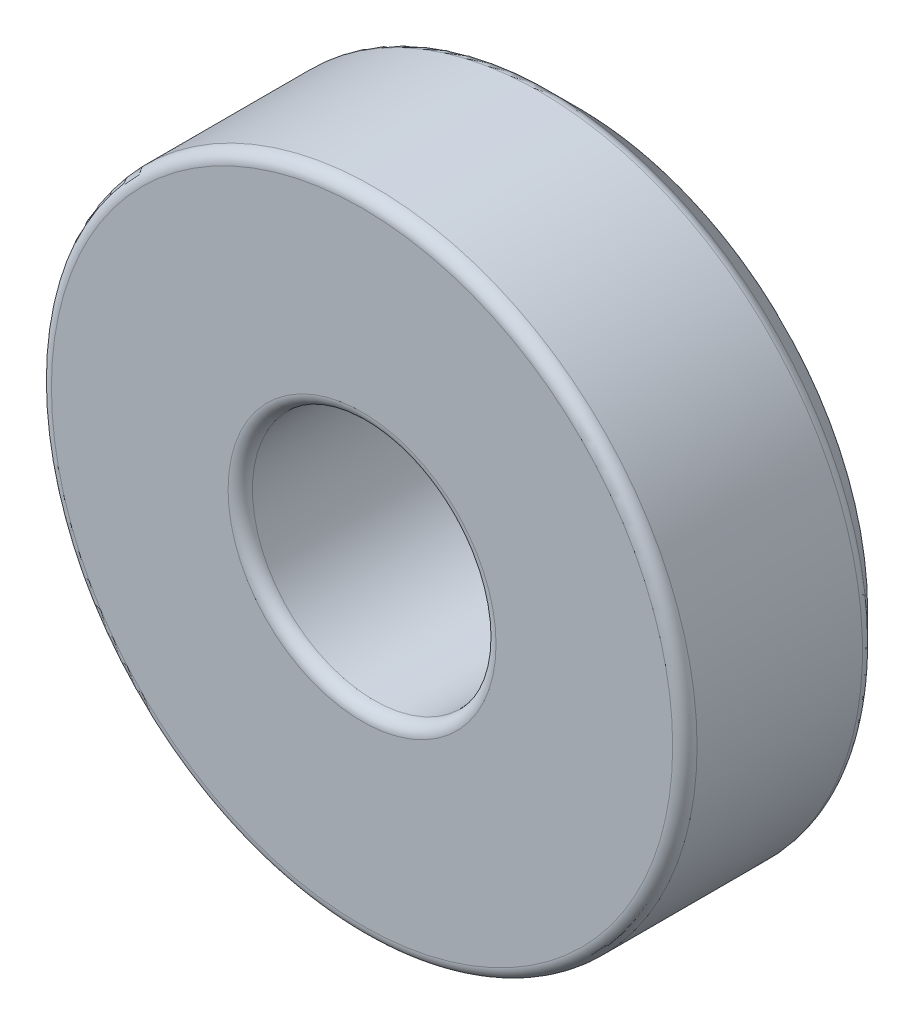
ISO-10303-21;
HEADER;
FILE_DESCRIPTION(('STEP AP214'),'2;1');
FILE_NAME('part.step','',(''),(''),'','','');
FILE_SCHEMA(('AUTOMOTIVE_DESIGN { 1 0 10303 214 1 1 1 1 }'));
ENDSEC;
DATA;
#1=APPLICATION_CONTEXT('core data for automotive mechanical design processes');
#2=APPLICATION_PROTOCOL_DEFINITION('international standard','automotive_design',2000,#1);
#3=PRODUCT_CONTEXT('',#1,'mechanical');
#4=PRODUCT('Part','Part','',(#3));
#5=PRODUCT_RELATED_PRODUCT_CATEGORY('part','',(#4));
#6=PRODUCT_DEFINITION_FORMATION('','',#4);
#7=PRODUCT_DEFINITION_CONTEXT('part definition',#1,'design');
#8=PRODUCT_DEFINITION('design','',#6,#7);
#9=PRODUCT_DEFINITION_SHAPE('','',#8);
#10=(LENGTH_UNIT() NAMED_UNIT(*) SI_UNIT(.MILLI.,.METRE.));
#11=(NAMED_UNIT(*) PLANE_ANGLE_UNIT() SI_UNIT($,.RADIAN.));
#12=(NAMED_UNIT(*) SI_UNIT($,.STERADIAN.) SOLID_ANGLE_UNIT());
#13=UNCERTAINTY_MEASURE_WITH_UNIT(LENGTH_MEASURE(1.E-05),#10,'distance_accuracy_value','');
#14=(GEOMETRIC_REPRESENTATION_CONTEXT(3) GLOBAL_UNCERTAINTY_ASSIGNED_CONTEXT((#13)) GLOBAL_UNIT_ASSIGNED_CONTEXT((#10,
#11,#12)) REPRESENTATION_CONTEXT('',''));
#15=CARTESIAN_POINT('',(0.,0.,0.));
#16=DIRECTION('',(0.,0.,1.));
#17=DIRECTION('',(1.,0.,0.));
#18=AXIS2_PLACEMENT_3D('',#15,#16,#17);
#19=CARTESIAN_POINT('',(0.,0.,0.9));
#20=DIRECTION('',(0.,0.,1.));
#21=DIRECTION('',(1.,0.,0.));
#22=AXIS2_PLACEMENT_3D('',#19,#20,#21);
#23=PLANE('',#22);
#24=CARTESIAN_POINT('',(0.,0.,0.9));
#25=DIRECTION('',(0.,0.,1.));
#26=DIRECTION('',(1.,0.,0.));
#27=AXIS2_PLACEMENT_3D('',#24,#25,#26);
#28=CIRCLE('',#27,0.55);
#29=CARTESIAN_POINT('',(0.55,0.,0.9));
#30=VERTEX_POINT('',#29);
#31=EDGE_CURVE('E10',#30,#30,#28,.F.);
#32=ORIENTED_EDGE('',*,*,#31,.T.);
#33=EDGE_LOOP('',(#32));
#34=FACE_BOUND('',#33,.T.);
#35=CARTESIAN_POINT('',(0.,0.,0.9));
#36=DIRECTION('',(0.,0.,1.));
#37=DIRECTION('',(1.,0.,0.));
#38=AXIS2_PLACEMENT_3D('',#35,#36,#37);
#39=CIRCLE('',#38,1.275);
#40=CARTESIAN_POINT('',(1.275,0.,0.9));
#41=VERTEX_POINT('',#40);
#42=EDGE_CURVE('E38',#41,#41,#39,.T.);
#43=ORIENTED_EDGE('',*,*,#42,.T.);
#44=EDGE_LOOP('',(#43));
#45=FACE_BOUND('',#44,.T.);
#46=ADVANCED_FACE('F31',(#34,#45),#23,.T.);
#47=CARTESIAN_POINT('',(0.,0.,0.));
#48=DIRECTION('',(0.,0.,1.));
#49=DIRECTION('',(1.,0.,0.));
#50=AXIS2_PLACEMENT_3D('',#47,#48,#49);
#51=PLANE('',#50);
#52=CARTESIAN_POINT('',(0.,0.,0.));
#53=DIRECTION('',(0.,0.,1.));
#54=DIRECTION('',(1.,0.,0.));
#55=AXIS2_PLACEMENT_3D('',#52,#53,#54);
#56=CIRCLE('',#55,0.55);
#57=CARTESIAN_POINT('',(0.55,0.,0.));
#58=VERTEX_POINT('',#57);
#59=EDGE_CURVE('E51',#58,#58,#56,.T.);
#60=ORIENTED_EDGE('',*,*,#59,.T.);
#61=EDGE_LOOP('',(#60));
#62=FACE_BOUND('',#61,.T.);
#63=CARTESIAN_POINT('',(0.,0.,0.));
#64=DIRECTION('',(0.,0.,1.));
#65=DIRECTION('',(1.,0.,0.));
#66=AXIS2_PLACEMENT_3D('',#63,#64,#65);
#67=CIRCLE('',#66,1.15428932188134);
#68=CARTESIAN_POINT('',(1.15428932188134,0.,0.));
#69=VERTEX_POINT('',#68);
#70=EDGE_CURVE('E54',#69,#69,#67,.F.);
#71=ORIENTED_EDGE('',*,*,#70,.T.);
#72=EDGE_LOOP('',(#71));
#73=FACE_BOUND('',#72,.T.);
#74=ADVANCED_FACE('F81',(#62,#73),#51,.F.);
#75=CARTESIAN_POINT('',(0.,0.,0.9));
#76=DIRECTION('',(0.,0.,-1.));
#77=DIRECTION('',(-1.,0.,0.));
#78=AXIS2_PLACEMENT_3D('',#75,#76,#77);
#79=CYLINDRICAL_SURFACE('',#78,1.325);
#80=CARTESIAN_POINT('',(0.,0.,0.170710678118655));
#81=DIRECTION('',(0.,0.,-1.));
#82=DIRECTION('',(-1.,0.,0.));
#83=AXIS2_PLACEMENT_3D('',#80,#81,#82);
#84=CIRCLE('',#83,1.325);
#85=CARTESIAN_POINT('',(-1.325,0.,0.170710678118655));
#86=VERTEX_POINT('',#85);
#87=EDGE_CURVE('E63',#86,#86,#84,.F.);
#88=ORIENTED_EDGE('',*,*,#87,.T.);
#89=EDGE_LOOP('',(#88));
#90=FACE_BOUND('',#89,.T.);
#91=CARTESIAN_POINT('',(0.,0.,0.85));
#92=DIRECTION('',(0.,0.,1.));
#93=DIRECTION('',(1.,0.,0.));
#94=AXIS2_PLACEMENT_3D('',#91,#92,#93);
#95=CIRCLE('',#94,1.325);
#96=CARTESIAN_POINT('',(1.325,0.,0.85));
#97=VERTEX_POINT('',#96);
#98=EDGE_CURVE('E66',#97,#97,#95,.F.);
#99=ORIENTED_EDGE('',*,*,#98,.T.);
#100=EDGE_LOOP('',(#99));
#101=FACE_BOUND('',#100,.T.);
#102=ADVANCED_FACE('F70',(#90,#101),#79,.T.);
#103=CARTESIAN_POINT('',(0.,0.,0.9));
#104=DIRECTION('',(0.,0.,-1.));
#105=DIRECTION('',(-1.,0.,0.));
#106=AXIS2_PLACEMENT_3D('',#103,#104,#105);
#107=CYLINDRICAL_SURFACE('',#106,0.5);
#108=CARTESIAN_POINT('',(0.,0.,0.05));
#109=DIRECTION('',(0.,0.,1.));
#110=DIRECTION('',(1.,0.,0.));
#111=AXIS2_PLACEMENT_3D('',#108,#109,#110);
#112=CIRCLE('',#111,0.5);
#113=CARTESIAN_POINT('',(0.5,0.,0.05));
#114=VERTEX_POINT('',#113);
#115=EDGE_CURVE('E42',#114,#114,#112,.F.);
#116=ORIENTED_EDGE('',*,*,#115,.T.);
#117=EDGE_LOOP('',(#116));
#118=FACE_BOUND('',#117,.T.);
#119=CARTESIAN_POINT('',(0.,0.,0.85));
#120=DIRECTION('',(0.,0.,1.));
#121=DIRECTION('',(1.,0.,0.));
#122=AXIS2_PLACEMENT_3D('',#119,#120,#121);
#123=CIRCLE('',#122,0.5);
#124=CARTESIAN_POINT('',(0.5,0.,0.85));
#125=VERTEX_POINT('',#124);
#126=EDGE_CURVE('E46',#125,#125,#123,.T.);
#127=ORIENTED_EDGE('',*,*,#126,.T.);
#128=EDGE_LOOP('',(#127));
#129=FACE_BOUND('',#128,.T.);
#130=ADVANCED_FACE('F89',(#118,#129),#107,.F.);
#131=CARTESIAN_POINT('',(0.,0.,0.15));
#132=DIRECTION('',(0.,0.,1.));
#133=DIRECTION('',(1.,0.,0.));
#134=AXIS2_PLACEMENT_3D('',#131,#132,#133);
#135=CONICAL_SURFACE('',#134,1.325,0.785398163397449);
#136=CARTESIAN_POINT('',(0.,0.,0.135355339059328));
#137=DIRECTION('',(0.,0.,1.));
#138=DIRECTION('',(1.,0.,0.));
#139=AXIS2_PLACEMENT_3D('',#136,#137,#138);
#140=CIRCLE('',#139,1.31035533905933);
#141=CARTESIAN_POINT('',(1.31035533905933,0.,0.135355339059328));
#142=VERTEX_POINT('',#141);
#143=EDGE_CURVE('E57',#142,#142,#140,.F.);
#144=ORIENTED_EDGE('',*,*,#143,.T.);
#145=EDGE_LOOP('',(#144));
#146=FACE_BOUND('',#145,.T.);
#147=CARTESIAN_POINT('',(0.,0.,0.0146446609406725));
#148=DIRECTION('',(0.,0.,1.));
#149=DIRECTION('',(1.,0.,0.));
#150=AXIS2_PLACEMENT_3D('',#147,#148,#149);
#151=CIRCLE('',#150,1.18964466094067);
#152=CARTESIAN_POINT('',(1.18964466094067,0.,0.0146446609406725));
#153=VERTEX_POINT('',#152);
#154=EDGE_CURVE('E60',#153,#153,#151,.T.);
#155=ORIENTED_EDGE('',*,*,#154,.T.);
#156=EDGE_LOOP('',(#155));
#157=FACE_BOUND('',#156,.T.);
#158=ADVANCED_FACE('F94',(#146,#157),#135,.T.);
#159=CARTESIAN_POINT('',(0.,0.,0.170710678118655));
#160=DIRECTION('',(0.,0.,-1.));
#161=DIRECTION('',(-1.,0.,0.));
#162=AXIS2_PLACEMENT_3D('',#159,#160,#161);
#163=TOROIDAL_SURFACE('',#162,1.275,0.05);
#164=ORIENTED_EDGE('',*,*,#143,.F.);
#165=EDGE_LOOP('',(#164));
#166=FACE_BOUND('',#165,.T.);
#167=ORIENTED_EDGE('',*,*,#87,.F.);
#168=EDGE_LOOP('',(#167));
#169=FACE_BOUND('',#168,.T.);
#170=ADVANCED_FACE('F97',(#166,#169),#163,.T.);
#171=CARTESIAN_POINT('',(0.,0.,0.05));
#172=DIRECTION('',(0.,0.,1.));
#173=DIRECTION('',(1.,0.,0.));
#174=AXIS2_PLACEMENT_3D('',#171,#172,#173);
#175=TOROIDAL_SURFACE('',#174,0.55,0.05);
#176=ORIENTED_EDGE('',*,*,#115,.F.);
#177=EDGE_LOOP('',(#176));
#178=FACE_BOUND('',#177,.T.);
#179=ORIENTED_EDGE('',*,*,#59,.F.);
#180=EDGE_LOOP('',(#179));
#181=FACE_BOUND('',#180,.T.);
#182=ADVANCED_FACE('F101',(#178,#181),#175,.T.);
#183=CARTESIAN_POINT('',(0.,0.,0.05));
#184=DIRECTION('',(0.,0.,1.));
#185=DIRECTION('',(1.,0.,0.));
#186=AXIS2_PLACEMENT_3D('',#183,#184,#185);
#187=TOROIDAL_SURFACE('',#186,1.15428932188134,0.05);
#188=ORIENTED_EDGE('',*,*,#154,.F.);
#189=EDGE_LOOP('',(#188));
#190=FACE_BOUND('',#189,.T.);
#191=ORIENTED_EDGE('',*,*,#70,.F.);
#192=EDGE_LOOP('',(#191));
#193=FACE_BOUND('',#192,.T.);
#194=ADVANCED_FACE('F78',(#190,#193),#187,.T.);
#195=CARTESIAN_POINT('',(0.,0.,0.85));
#196=DIRECTION('',(0.,0.,1.));
#197=DIRECTION('',(1.,0.,0.));
#198=AXIS2_PLACEMENT_3D('',#195,#196,#197);
#199=TOROIDAL_SURFACE('',#198,0.55,0.05);
#200=ORIENTED_EDGE('',*,*,#31,.F.);
#201=EDGE_LOOP('',(#200));
#202=FACE_BOUND('',#201,.T.);
#203=ORIENTED_EDGE('',*,*,#126,.F.);
#204=EDGE_LOOP('',(#203));
#205=FACE_BOUND('',#204,.T.);
#206=ADVANCED_FACE('F74',(#202,#205),#199,.T.);
#207=CARTESIAN_POINT('',(0.,0.,0.85));
#208=DIRECTION('',(0.,0.,1.));
#209=DIRECTION('',(1.,0.,0.));
#210=AXIS2_PLACEMENT_3D('',#207,#208,#209);
#211=TOROIDAL_SURFACE('',#210,1.275,0.05);
#212=ORIENTED_EDGE('',*,*,#98,.F.);
#213=EDGE_LOOP('',(#212));
#214=FACE_BOUND('',#213,.T.);
#215=ORIENTED_EDGE('',*,*,#42,.F.);
#216=EDGE_LOOP('',(#215));
#217=FACE_BOUND('',#216,.T.);
#218=ADVANCED_FACE('F33',(#214,#217),#211,.T.);
#219=CLOSED_SHELL('',(#46,#74,#102,#130,#158,#170,#182,#194,#206,#218));
#220=MANIFOLD_SOLID_BREP('B2',#219);
#221=ADVANCED_BREP_SHAPE_REPRESENTATION('',(#18,#220),#14);
#222=SHAPE_DEFINITION_REPRESENTATION(#9,#221);
ENDSEC;
END-ISO-10303-21;
